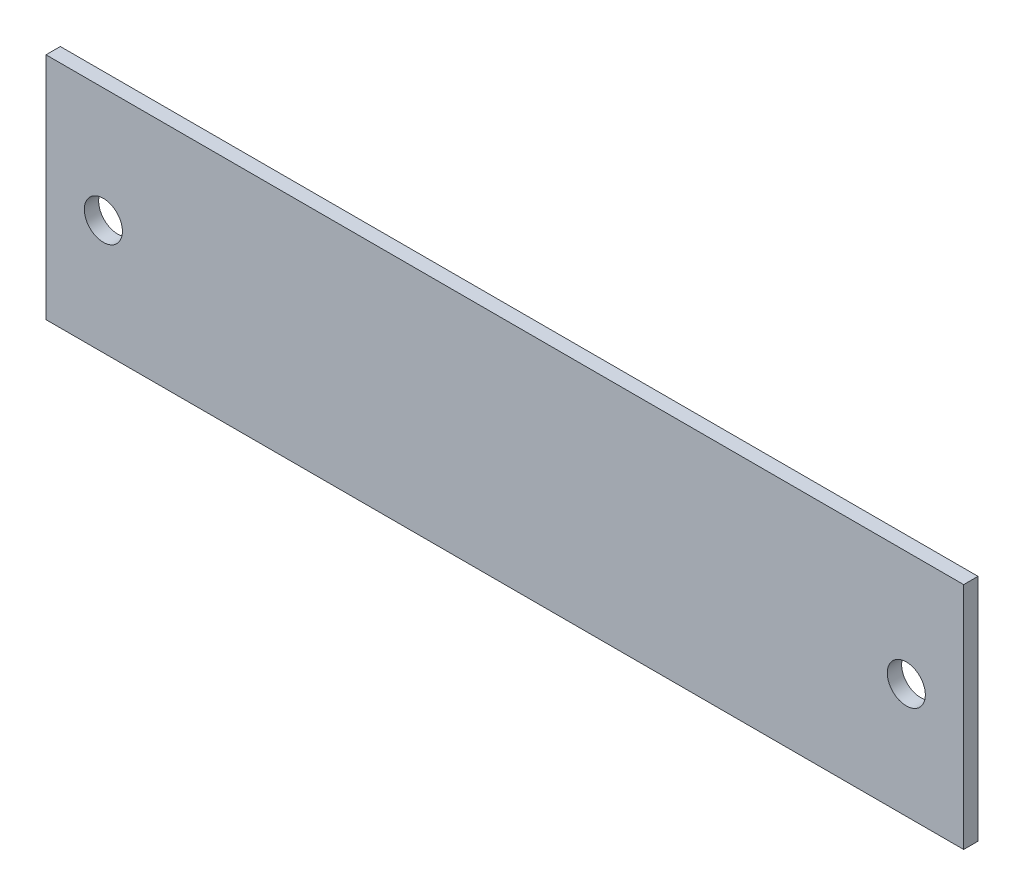
ISO-10303-21;
HEADER;
FILE_DESCRIPTION(('STEP AP214'),'2;1');
FILE_NAME('part.step','',(''),(''),'','','');
FILE_SCHEMA(('AUTOMOTIVE_DESIGN { 1 0 10303 214 1 1 1 1 }'));
ENDSEC;
DATA;
#1=APPLICATION_CONTEXT('core data for automotive mechanical design processes');
#2=APPLICATION_PROTOCOL_DEFINITION('international standard','automotive_design',2000,#1);
#3=PRODUCT_CONTEXT('',#1,'mechanical');
#4=PRODUCT('Part','Part','',(#3));
#5=PRODUCT_RELATED_PRODUCT_CATEGORY('part','',(#4));
#6=PRODUCT_DEFINITION_FORMATION('','',#4);
#7=PRODUCT_DEFINITION_CONTEXT('part definition',#1,'design');
#8=PRODUCT_DEFINITION('design','',#6,#7);
#9=PRODUCT_DEFINITION_SHAPE('','',#8);
#10=(LENGTH_UNIT() NAMED_UNIT(*) SI_UNIT(.MILLI.,.METRE.));
#11=(NAMED_UNIT(*) PLANE_ANGLE_UNIT() SI_UNIT($,.RADIAN.));
#12=(NAMED_UNIT(*) SI_UNIT($,.STERADIAN.) SOLID_ANGLE_UNIT());
#13=UNCERTAINTY_MEASURE_WITH_UNIT(LENGTH_MEASURE(1.E-05),#10,'distance_accuracy_value','');
#14=(GEOMETRIC_REPRESENTATION_CONTEXT(3) GLOBAL_UNCERTAINTY_ASSIGNED_CONTEXT((#13)) GLOBAL_UNIT_ASSIGNED_CONTEXT((#10,
#11,#12)) REPRESENTATION_CONTEXT('',''));
#15=CARTESIAN_POINT('',(0.,0.,0.));
#16=DIRECTION('',(0.,0.,1.));
#17=DIRECTION('',(1.,0.,0.));
#18=AXIS2_PLACEMENT_3D('',#15,#16,#17);
#19=CARTESIAN_POINT('',(0.,0.,1.5875));
#20=DIRECTION('',(0.,0.,1.));
#21=DIRECTION('',(1.,0.,0.));
#22=AXIS2_PLACEMENT_3D('',#19,#20,#21);
#23=PLANE('',#22);
#24=CARTESIAN_POINT('',(-44.45,0.,1.5875));
#25=DIRECTION('',(0.,0.,1.));
#26=DIRECTION('',(1.,0.,0.));
#27=AXIS2_PLACEMENT_3D('',#24,#25,#26);
#28=CIRCLE('',#27,2.1082);
#29=CARTESIAN_POINT('',(-42.3418,0.,1.5875));
#30=VERTEX_POINT('',#29);
#31=EDGE_CURVE('E100',#30,#30,#28,.T.);
#32=ORIENTED_EDGE('',*,*,#31,.F.);
#33=EDGE_LOOP('',(#32));
#34=FACE_BOUND('',#33,.T.);
#35=DIRECTION('',(0.,-1.,0.));
#36=VECTOR('',#35,1.);
#37=CARTESIAN_POINT('',(-50.8,-12.7,1.5875));
#38=LINE('',#37,#36);
#39=CARTESIAN_POINT('',(-50.8,12.7,1.5875));
#40=VERTEX_POINT('',#39);
#41=CARTESIAN_POINT('',(-50.8,-12.7,1.5875));
#42=VERTEX_POINT('',#41);
#43=EDGE_CURVE('E85',#40,#42,#38,.T.);
#44=ORIENTED_EDGE('',*,*,#43,.T.);
#45=DIRECTION('',(1.,0.,0.));
#46=VECTOR('',#45,1.);
#47=CARTESIAN_POINT('',(50.8,-12.7,1.5875));
#48=LINE('',#47,#46);
#49=CARTESIAN_POINT('',(50.8,-12.7,1.5875));
#50=VERTEX_POINT('',#49);
#51=EDGE_CURVE('E80',#42,#50,#48,.T.);
#52=ORIENTED_EDGE('',*,*,#51,.T.);
#53=DIRECTION('',(0.,1.,0.));
#54=VECTOR('',#53,1.);
#55=CARTESIAN_POINT('',(50.8,-12.7,1.5875));
#56=LINE('',#55,#54);
#57=CARTESIAN_POINT('',(50.8,12.7,1.5875));
#58=VERTEX_POINT('',#57);
#59=EDGE_CURVE('E83',#50,#58,#56,.T.);
#60=ORIENTED_EDGE('',*,*,#59,.T.);
#61=DIRECTION('',(-1.,0.,0.));
#62=VECTOR('',#61,1.);
#63=CARTESIAN_POINT('',(50.8,12.7,1.5875));
#64=LINE('',#63,#62);
#65=EDGE_CURVE('E50',#58,#40,#64,.T.);
#66=ORIENTED_EDGE('',*,*,#65,.T.);
#67=EDGE_LOOP('',(#44,#52,#60,#66));
#68=FACE_BOUND('',#67,.T.);
#69=CARTESIAN_POINT('',(44.45,0.,1.5875));
#70=DIRECTION('',(0.,0.,1.));
#71=DIRECTION('',(1.,0.,0.));
#72=AXIS2_PLACEMENT_3D('',#69,#70,#71);
#73=CIRCLE('',#72,2.1082);
#74=CARTESIAN_POINT('',(46.5582,0.,1.5875));
#75=VERTEX_POINT('',#74);
#76=EDGE_CURVE('E115',#75,#75,#73,.T.);
#77=ORIENTED_EDGE('',*,*,#76,.F.);
#78=EDGE_LOOP('',(#77));
#79=FACE_BOUND('',#78,.T.);
#80=ADVANCED_FACE('F33',(#34,#68,#79),#23,.T.);
#81=CARTESIAN_POINT('',(0.,0.,0.));
#82=DIRECTION('',(0.,0.,1.));
#83=DIRECTION('',(1.,0.,0.));
#84=AXIS2_PLACEMENT_3D('',#81,#82,#83);
#85=PLANE('',#84);
#86=DIRECTION('',(0.,-1.,0.));
#87=VECTOR('',#86,1.);
#88=CARTESIAN_POINT('',(-50.8,-12.7,0.));
#89=LINE('',#88,#87);
#90=CARTESIAN_POINT('',(-50.8,12.7,0.));
#91=VERTEX_POINT('',#90);
#92=CARTESIAN_POINT('',(-50.8,-12.7,0.));
#93=VERTEX_POINT('',#92);
#94=EDGE_CURVE('E97',#91,#93,#89,.T.);
#95=ORIENTED_EDGE('',*,*,#94,.F.);
#96=DIRECTION('',(-1.,0.,0.));
#97=VECTOR('',#96,1.);
#98=CARTESIAN_POINT('',(50.8,12.7,0.));
#99=LINE('',#98,#97);
#100=CARTESIAN_POINT('',(50.8,12.7,0.));
#101=VERTEX_POINT('',#100);
#102=EDGE_CURVE('E73',#101,#91,#99,.T.);
#103=ORIENTED_EDGE('',*,*,#102,.F.);
#104=DIRECTION('',(0.,1.,0.));
#105=VECTOR('',#104,1.);
#106=CARTESIAN_POINT('',(50.8,-12.7,0.));
#107=LINE('',#106,#105);
#108=CARTESIAN_POINT('',(50.8,-12.7,0.));
#109=VERTEX_POINT('',#108);
#110=EDGE_CURVE('E67',#109,#101,#107,.T.);
#111=ORIENTED_EDGE('',*,*,#110,.F.);
#112=DIRECTION('',(1.,0.,0.));
#113=VECTOR('',#112,1.);
#114=CARTESIAN_POINT('',(50.8,-12.7,0.));
#115=LINE('',#114,#113);
#116=EDGE_CURVE('E89',#93,#109,#115,.T.);
#117=ORIENTED_EDGE('',*,*,#116,.F.);
#118=EDGE_LOOP('',(#95,#103,#111,#117));
#119=FACE_BOUND('',#118,.T.);
#120=CARTESIAN_POINT('',(-44.45,0.,0.));
#121=DIRECTION('',(0.,0.,1.));
#122=DIRECTION('',(1.,0.,0.));
#123=AXIS2_PLACEMENT_3D('',#120,#121,#122);
#124=CIRCLE('',#123,2.1082);
#125=CARTESIAN_POINT('',(-42.3418,0.,0.));
#126=VERTEX_POINT('',#125);
#127=EDGE_CURVE('E112',#126,#126,#124,.T.);
#128=ORIENTED_EDGE('',*,*,#127,.T.);
#129=EDGE_LOOP('',(#128));
#130=FACE_BOUND('',#129,.T.);
#131=CARTESIAN_POINT('',(44.45,0.,0.));
#132=DIRECTION('',(0.,0.,1.));
#133=DIRECTION('',(1.,0.,0.));
#134=AXIS2_PLACEMENT_3D('',#131,#132,#133);
#135=CIRCLE('',#134,2.1082);
#136=CARTESIAN_POINT('',(46.5582,0.,0.));
#137=VERTEX_POINT('',#136);
#138=EDGE_CURVE('E118',#137,#137,#135,.T.);
#139=ORIENTED_EDGE('',*,*,#138,.T.);
#140=EDGE_LOOP('',(#139));
#141=FACE_BOUND('',#140,.T.);
#142=ADVANCED_FACE('F108',(#119,#130,#141),#85,.F.);
#143=CARTESIAN_POINT('',(-50.8,-12.7,1.5875));
#144=DIRECTION('',(1.,0.,0.));
#145=DIRECTION('',(0.,0.,-1.));
#146=AXIS2_PLACEMENT_3D('',#143,#144,#145);
#147=PLANE('',#146);
#148=ORIENTED_EDGE('',*,*,#94,.T.);
#149=DIRECTION('',(0.,0.,-1.));
#150=VECTOR('',#149,1.);
#151=CARTESIAN_POINT('',(-50.8,-12.7,1.5875));
#152=LINE('',#151,#150);
#153=EDGE_CURVE('E11',#42,#93,#152,.T.);
#154=ORIENTED_EDGE('',*,*,#153,.F.);
#155=ORIENTED_EDGE('',*,*,#43,.F.);
#156=DIRECTION('',(0.,0.,-1.));
#157=VECTOR('',#156,1.);
#158=CARTESIAN_POINT('',(-50.8,12.7,1.5875));
#159=LINE('',#158,#157);
#160=EDGE_CURVE('E93',#40,#91,#159,.T.);
#161=ORIENTED_EDGE('',*,*,#160,.T.);
#162=EDGE_LOOP('',(#148,#154,#155,#161));
#163=FACE_BOUND('',#162,.T.);
#164=ADVANCED_FACE('F35',(#163),#147,.F.);
#165=CARTESIAN_POINT('',(50.8,-12.7,1.5875));
#166=DIRECTION('',(0.,1.,0.));
#167=DIRECTION('',(-1.,0.,0.));
#168=AXIS2_PLACEMENT_3D('',#165,#166,#167);
#169=PLANE('',#168);
#170=ORIENTED_EDGE('',*,*,#116,.T.);
#171=DIRECTION('',(0.,0.,-1.));
#172=VECTOR('',#171,1.);
#173=CARTESIAN_POINT('',(50.8,-12.7,1.5875));
#174=LINE('',#173,#172);
#175=EDGE_CURVE('E42',#50,#109,#174,.T.);
#176=ORIENTED_EDGE('',*,*,#175,.F.);
#177=ORIENTED_EDGE('',*,*,#51,.F.);
#178=ORIENTED_EDGE('',*,*,#153,.T.);
#179=EDGE_LOOP('',(#170,#176,#177,#178));
#180=FACE_BOUND('',#179,.T.);
#181=ADVANCED_FACE('F88',(#180),#169,.F.);
#182=CARTESIAN_POINT('',(50.8,-12.7,1.5875));
#183=DIRECTION('',(-1.,0.,0.));
#184=DIRECTION('',(0.,0.,1.));
#185=AXIS2_PLACEMENT_3D('',#182,#183,#184);
#186=PLANE('',#185);
#187=ORIENTED_EDGE('',*,*,#110,.T.);
#188=DIRECTION('',(0.,0.,-1.));
#189=VECTOR('',#188,1.);
#190=CARTESIAN_POINT('',(50.8,12.7,1.5875));
#191=LINE('',#190,#189);
#192=EDGE_CURVE('E90',#58,#101,#191,.T.);
#193=ORIENTED_EDGE('',*,*,#192,.F.);
#194=ORIENTED_EDGE('',*,*,#59,.F.);
#195=ORIENTED_EDGE('',*,*,#175,.T.);
#196=EDGE_LOOP('',(#187,#193,#194,#195));
#197=FACE_BOUND('',#196,.T.);
#198=ADVANCED_FACE('F91',(#197),#186,.F.);
#199=CARTESIAN_POINT('',(50.8,12.7,1.5875));
#200=DIRECTION('',(0.,-1.,0.));
#201=DIRECTION('',(1.,0.,0.));
#202=AXIS2_PLACEMENT_3D('',#199,#200,#201);
#203=PLANE('',#202);
#204=ORIENTED_EDGE('',*,*,#102,.T.);
#205=ORIENTED_EDGE('',*,*,#160,.F.);
#206=ORIENTED_EDGE('',*,*,#65,.F.);
#207=ORIENTED_EDGE('',*,*,#192,.T.);
#208=EDGE_LOOP('',(#204,#205,#206,#207));
#209=FACE_BOUND('',#208,.T.);
#210=ADVANCED_FACE('F105',(#209),#203,.F.);
#211=CARTESIAN_POINT('',(-44.45,0.,1.5875));
#212=DIRECTION('',(0.,0.,-1.));
#213=DIRECTION('',(-1.,0.,0.));
#214=AXIS2_PLACEMENT_3D('',#211,#212,#213);
#215=CYLINDRICAL_SURFACE('',#214,2.1082);
#216=ORIENTED_EDGE('',*,*,#31,.T.);
#217=EDGE_LOOP('',(#216));
#218=FACE_BOUND('',#217,.T.);
#219=ORIENTED_EDGE('',*,*,#127,.F.);
#220=EDGE_LOOP('',(#219));
#221=FACE_BOUND('',#220,.T.);
#222=ADVANCED_FACE('F135',(#218,#221),#215,.F.);
#223=CARTESIAN_POINT('',(44.45,0.,1.5875));
#224=DIRECTION('',(0.,0.,-1.));
#225=DIRECTION('',(-1.,0.,0.));
#226=AXIS2_PLACEMENT_3D('',#223,#224,#225);
#227=CYLINDRICAL_SURFACE('',#226,2.1082);
#228=ORIENTED_EDGE('',*,*,#76,.T.);
#229=EDGE_LOOP('',(#228));
#230=FACE_BOUND('',#229,.T.);
#231=ORIENTED_EDGE('',*,*,#138,.F.);
#232=EDGE_LOOP('',(#231));
#233=FACE_BOUND('',#232,.T.);
#234=ADVANCED_FACE('F124',(#230,#233),#227,.F.);
#235=CLOSED_SHELL('',(#80,#142,#164,#181,#198,#210,#222,#234));
#236=MANIFOLD_SOLID_BREP('B2',#235);
#237=ADVANCED_BREP_SHAPE_REPRESENTATION('',(#18,#236),#14);
#238=SHAPE_DEFINITION_REPRESENTATION(#9,#237);
ENDSEC;
END-ISO-10303-21;
